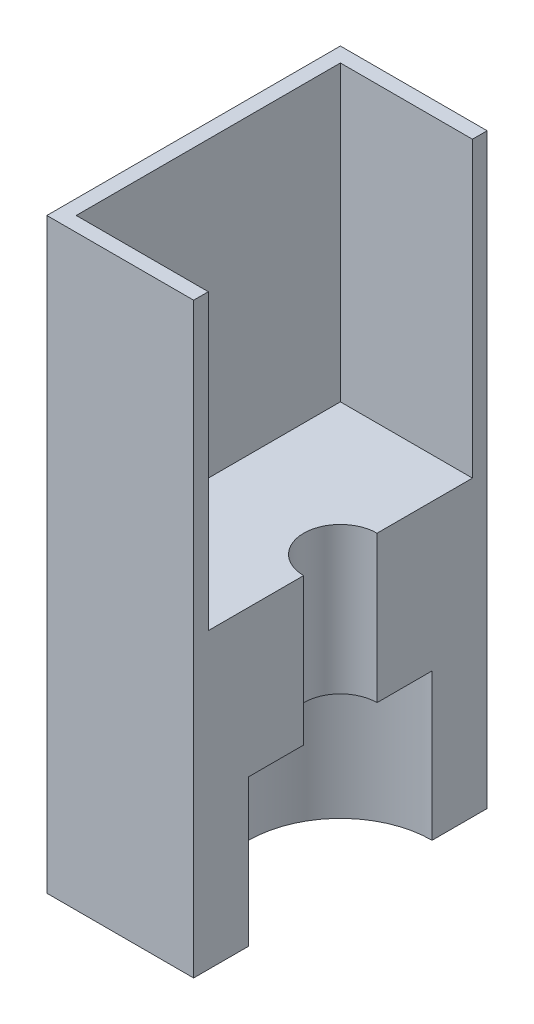
ISO-10303-21;
HEADER;
FILE_DESCRIPTION(('STEP AP214'),'2;1');
FILE_NAME('part.step','',(''),(''),'','','');
FILE_SCHEMA(('AUTOMOTIVE_DESIGN { 1 0 10303 214 1 1 1 1 }'));
ENDSEC;
DATA;
#1=APPLICATION_CONTEXT('core data for automotive mechanical design processes');
#2=APPLICATION_PROTOCOL_DEFINITION('international standard','automotive_design',2000,#1);
#3=PRODUCT_CONTEXT('',#1,'mechanical');
#4=PRODUCT('Part','Part','',(#3));
#5=PRODUCT_RELATED_PRODUCT_CATEGORY('part','',(#4));
#6=PRODUCT_DEFINITION_FORMATION('','',#4);
#7=PRODUCT_DEFINITION_CONTEXT('part definition',#1,'design');
#8=PRODUCT_DEFINITION('design','',#6,#7);
#9=PRODUCT_DEFINITION_SHAPE('','',#8);
#10=(LENGTH_UNIT() NAMED_UNIT(*) SI_UNIT(.MILLI.,.METRE.));
#11=(NAMED_UNIT(*) PLANE_ANGLE_UNIT() SI_UNIT($,.RADIAN.));
#12=(NAMED_UNIT(*) SI_UNIT($,.STERADIAN.) SOLID_ANGLE_UNIT());
#13=UNCERTAINTY_MEASURE_WITH_UNIT(LENGTH_MEASURE(1.E-05),#10,'distance_accuracy_value','');
#14=(GEOMETRIC_REPRESENTATION_CONTEXT(3) GLOBAL_UNCERTAINTY_ASSIGNED_CONTEXT((#13)) GLOBAL_UNIT_ASSIGNED_CONTEXT((#10,
#11,#12)) REPRESENTATION_CONTEXT('',''));
#15=CARTESIAN_POINT('',(0.,0.,0.));
#16=DIRECTION('',(0.,0.,1.));
#17=DIRECTION('',(1.,0.,0.));
#18=AXIS2_PLACEMENT_3D('',#15,#16,#17);
#19=CARTESIAN_POINT('',(0.,-0.00999999999999612,0.));
#20=DIRECTION('',(-1.,0.,0.));
#21=DIRECTION('',(0.,0.,1.));
#22=AXIS2_PLACEMENT_3D('',#19,#20,#21);
#23=PLANE('',#22);
#24=DIRECTION('',(0.,-1.,0.));
#25=VECTOR('',#24,1.);
#26=CARTESIAN_POINT('',(0.,80.,-20.));
#27=LINE('',#26,#25);
#28=CARTESIAN_POINT('',(0.,80.,-20.));
#29=VERTEX_POINT('',#28);
#30=CARTESIAN_POINT('',(0.,0.,-20.));
#31=VERTEX_POINT('',#30);
#32=EDGE_CURVE('E204',#29,#31,#27,.T.);
#33=ORIENTED_EDGE('',*,*,#32,.F.);
#34=DIRECTION('',(0.,0.,1.));
#35=VECTOR('',#34,1.);
#36=CARTESIAN_POINT('',(0.,80.,0.));
#37=LINE('',#36,#35);
#38=CARTESIAN_POINT('',(0.,80.,-18.));
#39=VERTEX_POINT('',#38);
#40=EDGE_CURVE('E201',#29,#39,#37,.T.);
#41=ORIENTED_EDGE('',*,*,#40,.T.);
#42=DIRECTION('',(0.,1.,0.));
#43=VECTOR('',#42,1.);
#44=CARTESIAN_POINT('',(0.,40.,-18.));
#45=LINE('',#44,#43);
#46=CARTESIAN_POINT('',(0.,40.,-18.));
#47=VERTEX_POINT('',#46);
#48=EDGE_CURVE('E196',#47,#39,#45,.T.);
#49=ORIENTED_EDGE('',*,*,#48,.F.);
#50=DIRECTION('',(0.,0.,1.));
#51=VECTOR('',#50,1.);
#52=CARTESIAN_POINT('',(0.,40.,0.));
#53=LINE('',#52,#51);
#54=CARTESIAN_POINT('',(0.,40.,-5.));
#55=VERTEX_POINT('',#54);
#56=EDGE_CURVE('E50',#47,#55,#53,.T.);
#57=ORIENTED_EDGE('',*,*,#56,.T.);
#58=DIRECTION('',(0.,-1.,0.));
#59=VECTOR('',#58,1.);
#60=CARTESIAN_POINT('',(0.,60.,-5.));
#61=LINE('',#60,#59);
#62=CARTESIAN_POINT('',(0.,20.,-5.));
#63=VERTEX_POINT('',#62);
#64=EDGE_CURVE('E194',#63,#55,#61,.F.);
#65=ORIENTED_EDGE('',*,*,#64,.F.);
#66=DIRECTION('',(0.,0.,-1.));
#67=VECTOR('',#66,1.);
#68=CARTESIAN_POINT('',(0.,20.,0.));
#69=LINE('',#68,#67);
#70=CARTESIAN_POINT('',(0.,20.,-12.5));
#71=VERTEX_POINT('',#70);
#72=EDGE_CURVE('E210',#63,#71,#69,.T.);
#73=ORIENTED_EDGE('',*,*,#72,.T.);
#74=DIRECTION('',(0.,-1.,0.));
#75=VECTOR('',#74,1.);
#76=CARTESIAN_POINT('',(0.,20.,-12.5));
#77=LINE('',#76,#75);
#78=CARTESIAN_POINT('',(0.,0.,-12.5));
#79=VERTEX_POINT('',#78);
#80=EDGE_CURVE('E45',#79,#71,#77,.F.);
#81=ORIENTED_EDGE('',*,*,#80,.F.);
#82=DIRECTION('',(0.,0.,1.));
#83=VECTOR('',#82,1.);
#84=CARTESIAN_POINT('',(0.,0.,0.));
#85=LINE('',#84,#83);
#86=EDGE_CURVE('E205',#31,#79,#85,.T.);
#87=ORIENTED_EDGE('',*,*,#86,.F.);
#88=EDGE_LOOP('',(#33,#41,#49,#57,#65,#73,#81,#87));
#89=FACE_BOUND('',#88,.T.);
#90=ADVANCED_FACE('F42',(#89),#23,.F.);
#91=DIRECTION('',(0.,-1.,0.));
#92=VECTOR('',#91,1.);
#93=CARTESIAN_POINT('',(0.,20.,12.5));
#94=LINE('',#93,#92);
#95=CARTESIAN_POINT('',(0.,20.,12.5));
#96=VERTEX_POINT('',#95);
#97=CARTESIAN_POINT('',(0.,0.,12.5));
#98=VERTEX_POINT('',#97);
#99=EDGE_CURVE('E209',#96,#98,#94,.T.);
#100=ORIENTED_EDGE('',*,*,#99,.F.);
#101=CARTESIAN_POINT('',(0.,20.,5.));
#102=VERTEX_POINT('',#101);
#103=EDGE_CURVE('E200',#96,#102,#69,.T.);
#104=ORIENTED_EDGE('',*,*,#103,.T.);
#105=DIRECTION('',(0.,-1.,0.));
#106=VECTOR('',#105,1.);
#107=CARTESIAN_POINT('',(0.,60.,5.));
#108=LINE('',#107,#106);
#109=CARTESIAN_POINT('',(0.,40.,5.));
#110=VERTEX_POINT('',#109);
#111=EDGE_CURVE('E189',#110,#102,#108,.T.);
#112=ORIENTED_EDGE('',*,*,#111,.F.);
#113=CARTESIAN_POINT('',(0.,40.,18.));
#114=VERTEX_POINT('',#113);
#115=EDGE_CURVE('E11',#110,#114,#53,.T.);
#116=ORIENTED_EDGE('',*,*,#115,.T.);
#117=DIRECTION('',(0.,-1.,0.));
#118=VECTOR('',#117,1.);
#119=CARTESIAN_POINT('',(0.,40.,18.));
#120=LINE('',#119,#118);
#121=CARTESIAN_POINT('',(0.,80.,18.));
#122=VERTEX_POINT('',#121);
#123=EDGE_CURVE('E65',#122,#114,#120,.T.);
#124=ORIENTED_EDGE('',*,*,#123,.F.);
#125=CARTESIAN_POINT('',(0.,80.,20.));
#126=VERTEX_POINT('',#125);
#127=EDGE_CURVE('E197',#122,#126,#37,.T.);
#128=ORIENTED_EDGE('',*,*,#127,.T.);
#129=DIRECTION('',(0.,1.,0.));
#130=VECTOR('',#129,1.);
#131=CARTESIAN_POINT('',(0.,80.,20.));
#132=LINE('',#131,#130);
#133=CARTESIAN_POINT('',(0.,0.,20.));
#134=VERTEX_POINT('',#133);
#135=EDGE_CURVE('E202',#134,#126,#132,.T.);
#136=ORIENTED_EDGE('',*,*,#135,.F.);
#137=EDGE_CURVE('E215',#98,#134,#85,.T.);
#138=ORIENTED_EDGE('',*,*,#137,.F.);
#139=EDGE_LOOP('',(#100,#104,#112,#116,#124,#128,#136,#138));
#140=FACE_BOUND('',#139,.T.);
#141=ADVANCED_FACE('F228',(#140),#23,.F.);
#142=CARTESIAN_POINT('',(-20.,80.,-20.));
#143=DIRECTION('',(1.,0.,0.));
#144=DIRECTION('',(0.,0.,-1.));
#145=AXIS2_PLACEMENT_3D('',#142,#143,#144);
#146=PLANE('',#145);
#147=DIRECTION('',(0.,0.,1.));
#148=VECTOR('',#147,1.);
#149=CARTESIAN_POINT('',(-20.,0.,-20.));
#150=LINE('',#149,#148);
#151=CARTESIAN_POINT('',(-20.,0.,-20.));
#152=VERTEX_POINT('',#151);
#153=CARTESIAN_POINT('',(-20.,0.,20.));
#154=VERTEX_POINT('',#153);
#155=EDGE_CURVE('E180',#152,#154,#150,.T.);
#156=ORIENTED_EDGE('',*,*,#155,.T.);
#157=DIRECTION('',(0.,-1.,0.));
#158=VECTOR('',#157,1.);
#159=CARTESIAN_POINT('',(-20.,80.,20.));
#160=LINE('',#159,#158);
#161=CARTESIAN_POINT('',(-20.,80.,20.));
#162=VERTEX_POINT('',#161);
#163=EDGE_CURVE('E178',#162,#154,#160,.T.);
#164=ORIENTED_EDGE('',*,*,#163,.F.);
#165=DIRECTION('',(0.,0.,1.));
#166=VECTOR('',#165,1.);
#167=CARTESIAN_POINT('',(-20.,80.,-20.));
#168=LINE('',#167,#166);
#169=CARTESIAN_POINT('',(-20.,80.,-20.));
#170=VERTEX_POINT('',#169);
#171=EDGE_CURVE('E172',#170,#162,#168,.T.);
#172=ORIENTED_EDGE('',*,*,#171,.F.);
#173=DIRECTION('',(0.,-1.,0.));
#174=VECTOR('',#173,1.);
#175=CARTESIAN_POINT('',(-20.,80.,-20.));
#176=LINE('',#175,#174);
#177=EDGE_CURVE('E186',#170,#152,#176,.T.);
#178=ORIENTED_EDGE('',*,*,#177,.T.);
#179=EDGE_LOOP('',(#156,#164,#172,#178));
#180=FACE_BOUND('',#179,.T.);
#181=ADVANCED_FACE('F253',(#180),#146,.F.);
#182=CARTESIAN_POINT('',(-20.,80.,20.));
#183=DIRECTION('',(0.,0.,-1.));
#184=DIRECTION('',(-1.,0.,0.));
#185=AXIS2_PLACEMENT_3D('',#182,#183,#184);
#186=PLANE('',#185);
#187=DIRECTION('',(1.,0.,0.));
#188=VECTOR('',#187,1.);
#189=CARTESIAN_POINT('',(-20.,0.,20.));
#190=LINE('',#189,#188);
#191=EDGE_CURVE('E173',#154,#134,#190,.T.);
#192=ORIENTED_EDGE('',*,*,#191,.T.);
#193=ORIENTED_EDGE('',*,*,#135,.T.);
#194=DIRECTION('',(1.,0.,0.));
#195=VECTOR('',#194,1.);
#196=CARTESIAN_POINT('',(-20.,80.,20.));
#197=LINE('',#196,#195);
#198=EDGE_CURVE('E175',#162,#126,#197,.T.);
#199=ORIENTED_EDGE('',*,*,#198,.F.);
#200=ORIENTED_EDGE('',*,*,#163,.T.);
#201=EDGE_LOOP('',(#192,#193,#199,#200));
#202=FACE_BOUND('',#201,.T.);
#203=ADVANCED_FACE('F249',(#202),#186,.F.);
#204=CARTESIAN_POINT('',(-20.,80.,-20.));
#205=DIRECTION('',(0.,0.,1.));
#206=DIRECTION('',(1.,0.,0.));
#207=AXIS2_PLACEMENT_3D('',#204,#205,#206);
#208=PLANE('',#207);
#209=DIRECTION('',(-1.,0.,0.));
#210=VECTOR('',#209,1.);
#211=CARTESIAN_POINT('',(-20.,80.,-20.));
#212=LINE('',#211,#210);
#213=EDGE_CURVE('E170',#29,#170,#212,.T.);
#214=ORIENTED_EDGE('',*,*,#213,.F.);
#215=ORIENTED_EDGE('',*,*,#32,.T.);
#216=DIRECTION('',(-1.,0.,0.));
#217=VECTOR('',#216,1.);
#218=CARTESIAN_POINT('',(-20.,0.,-20.));
#219=LINE('',#218,#217);
#220=EDGE_CURVE('E167',#31,#152,#219,.T.);
#221=ORIENTED_EDGE('',*,*,#220,.T.);
#222=ORIENTED_EDGE('',*,*,#177,.F.);
#223=EDGE_LOOP('',(#214,#215,#221,#222));
#224=FACE_BOUND('',#223,.T.);
#225=ADVANCED_FACE('F256',(#224),#208,.F.);
#226=CARTESIAN_POINT('',(0.,0.,0.));
#227=DIRECTION('',(0.,1.,0.));
#228=DIRECTION('',(0.,0.,1.));
#229=AXIS2_PLACEMENT_3D('',#226,#227,#228);
#230=PLANE('',#229);
#231=ORIENTED_EDGE('',*,*,#220,.F.);
#232=ORIENTED_EDGE('',*,*,#86,.T.);
#233=CARTESIAN_POINT('',(0.,0.,0.));
#234=DIRECTION('',(0.,-1.,0.));
#235=DIRECTION('',(0.,0.,-1.));
#236=AXIS2_PLACEMENT_3D('',#233,#234,#235);
#237=CIRCLE('',#236,12.5);
#238=EDGE_CURVE('E162',#98,#79,#237,.T.);
#239=ORIENTED_EDGE('',*,*,#238,.F.);
#240=ORIENTED_EDGE('',*,*,#137,.T.);
#241=ORIENTED_EDGE('',*,*,#191,.F.);
#242=ORIENTED_EDGE('',*,*,#155,.F.);
#243=EDGE_LOOP('',(#231,#232,#239,#240,#241,#242));
#244=FACE_BOUND('',#243,.T.);
#245=ADVANCED_FACE('F245',(#244),#230,.F.);
#246=CARTESIAN_POINT('',(0.,20.,0.));
#247=DIRECTION('',(0.,-1.,0.));
#248=DIRECTION('',(0.,0.,-1.));
#249=AXIS2_PLACEMENT_3D('',#246,#247,#248);
#250=CYLINDRICAL_SURFACE('',#249,12.5);
#251=ORIENTED_EDGE('',*,*,#238,.T.);
#252=ORIENTED_EDGE('',*,*,#80,.T.);
#253=CARTESIAN_POINT('',(0.,20.,0.));
#254=DIRECTION('',(0.,-1.,0.));
#255=DIRECTION('',(0.,0.,-1.));
#256=AXIS2_PLACEMENT_3D('',#253,#254,#255);
#257=CIRCLE('',#256,12.5);
#258=EDGE_CURVE('E164',#96,#71,#257,.T.);
#259=ORIENTED_EDGE('',*,*,#258,.F.);
#260=ORIENTED_EDGE('',*,*,#99,.T.);
#261=EDGE_LOOP('',(#251,#252,#259,#260));
#262=FACE_BOUND('',#261,.T.);
#263=ADVANCED_FACE('F239',(#262),#250,.F.);
#264=CARTESIAN_POINT('',(0.,80.,0.));
#265=DIRECTION('',(0.,1.,0.));
#266=DIRECTION('',(0.,0.,1.));
#267=AXIS2_PLACEMENT_3D('',#264,#265,#266);
#268=PLANE('',#267);
#269=ORIENTED_EDGE('',*,*,#40,.F.);
#270=ORIENTED_EDGE('',*,*,#213,.T.);
#271=ORIENTED_EDGE('',*,*,#171,.T.);
#272=ORIENTED_EDGE('',*,*,#198,.T.);
#273=ORIENTED_EDGE('',*,*,#127,.F.);
#274=DIRECTION('',(1.,0.,0.));
#275=VECTOR('',#274,1.);
#276=CARTESIAN_POINT('',(-18.,80.,18.));
#277=LINE('',#276,#275);
#278=CARTESIAN_POINT('',(-18.,80.,18.));
#279=VERTEX_POINT('',#278);
#280=EDGE_CURVE('E139',#279,#122,#277,.T.);
#281=ORIENTED_EDGE('',*,*,#280,.F.);
#282=DIRECTION('',(0.,0.,1.));
#283=VECTOR('',#282,1.);
#284=CARTESIAN_POINT('',(-18.,80.,-18.));
#285=LINE('',#284,#283);
#286=CARTESIAN_POINT('',(-18.,80.,-18.));
#287=VERTEX_POINT('',#286);
#288=EDGE_CURVE('E158',#287,#279,#285,.T.);
#289=ORIENTED_EDGE('',*,*,#288,.F.);
#290=DIRECTION('',(-1.,0.,0.));
#291=VECTOR('',#290,1.);
#292=CARTESIAN_POINT('',(-18.,80.,-18.));
#293=LINE('',#292,#291);
#294=EDGE_CURVE('E145',#39,#287,#293,.T.);
#295=ORIENTED_EDGE('',*,*,#294,.F.);
#296=EDGE_LOOP('',(#269,#270,#271,#272,#273,#281,#289,#295));
#297=FACE_BOUND('',#296,.T.);
#298=ADVANCED_FACE('F221',(#297),#268,.T.);
#299=CARTESIAN_POINT('',(-18.,40.,18.));
#300=DIRECTION('',(0.,0.,1.));
#301=DIRECTION('',(1.,0.,0.));
#302=AXIS2_PLACEMENT_3D('',#299,#300,#301);
#303=PLANE('',#302);
#304=ORIENTED_EDGE('',*,*,#280,.T.);
#305=ORIENTED_EDGE('',*,*,#123,.T.);
#306=DIRECTION('',(1.,0.,0.));
#307=VECTOR('',#306,1.);
#308=CARTESIAN_POINT('',(-18.,40.,18.));
#309=LINE('',#308,#307);
#310=CARTESIAN_POINT('',(-18.,40.,18.));
#311=VERTEX_POINT('',#310);
#312=EDGE_CURVE('E150',#311,#114,#309,.T.);
#313=ORIENTED_EDGE('',*,*,#312,.F.);
#314=DIRECTION('',(0.,1.,0.));
#315=VECTOR('',#314,1.);
#316=CARTESIAN_POINT('',(-18.,40.,18.));
#317=LINE('',#316,#315);
#318=EDGE_CURVE('E149',#311,#279,#317,.T.);
#319=ORIENTED_EDGE('',*,*,#318,.T.);
#320=EDGE_LOOP('',(#304,#305,#313,#319));
#321=FACE_BOUND('',#320,.T.);
#322=ADVANCED_FACE('F223',(#321),#303,.F.);
#323=CARTESIAN_POINT('',(-18.,40.,-18.));
#324=DIRECTION('',(-1.,0.,0.));
#325=DIRECTION('',(0.,0.,1.));
#326=AXIS2_PLACEMENT_3D('',#323,#324,#325);
#327=PLANE('',#326);
#328=ORIENTED_EDGE('',*,*,#288,.T.);
#329=ORIENTED_EDGE('',*,*,#318,.F.);
#330=DIRECTION('',(0.,0.,1.));
#331=VECTOR('',#330,1.);
#332=CARTESIAN_POINT('',(-18.,40.,-18.));
#333=LINE('',#332,#331);
#334=CARTESIAN_POINT('',(-18.,40.,-18.));
#335=VERTEX_POINT('',#334);
#336=EDGE_CURVE('E137',#335,#311,#333,.T.);
#337=ORIENTED_EDGE('',*,*,#336,.F.);
#338=DIRECTION('',(0.,1.,0.));
#339=VECTOR('',#338,1.);
#340=CARTESIAN_POINT('',(-18.,40.,-18.));
#341=LINE('',#340,#339);
#342=EDGE_CURVE('E142',#335,#287,#341,.T.);
#343=ORIENTED_EDGE('',*,*,#342,.T.);
#344=EDGE_LOOP('',(#328,#329,#337,#343));
#345=FACE_BOUND('',#344,.T.);
#346=ADVANCED_FACE('F152',(#345),#327,.F.);
#347=CARTESIAN_POINT('',(-18.,40.,-18.));
#348=DIRECTION('',(0.,0.,-1.));
#349=DIRECTION('',(-1.,0.,0.));
#350=AXIS2_PLACEMENT_3D('',#347,#348,#349);
#351=PLANE('',#350);
#352=DIRECTION('',(-1.,0.,0.));
#353=VECTOR('',#352,1.);
#354=CARTESIAN_POINT('',(-18.,40.,-18.));
#355=LINE('',#354,#353);
#356=EDGE_CURVE('E132',#47,#335,#355,.T.);
#357=ORIENTED_EDGE('',*,*,#356,.F.);
#358=ORIENTED_EDGE('',*,*,#48,.T.);
#359=ORIENTED_EDGE('',*,*,#294,.T.);
#360=ORIENTED_EDGE('',*,*,#342,.F.);
#361=EDGE_LOOP('',(#357,#358,#359,#360));
#362=FACE_BOUND('',#361,.T.);
#363=ADVANCED_FACE('F143',(#362),#351,.F.);
#364=CARTESIAN_POINT('',(0.,40.,0.));
#365=DIRECTION('',(0.,1.,0.));
#366=DIRECTION('',(0.,0.,1.));
#367=AXIS2_PLACEMENT_3D('',#364,#365,#366);
#368=PLANE('',#367);
#369=ORIENTED_EDGE('',*,*,#56,.F.);
#370=ORIENTED_EDGE('',*,*,#356,.T.);
#371=ORIENTED_EDGE('',*,*,#336,.T.);
#372=ORIENTED_EDGE('',*,*,#312,.T.);
#373=ORIENTED_EDGE('',*,*,#115,.F.);
#374=CARTESIAN_POINT('',(0.,40.,0.));
#375=DIRECTION('',(0.,1.,0.));
#376=DIRECTION('',(0.,0.,1.));
#377=AXIS2_PLACEMENT_3D('',#374,#375,#376);
#378=CIRCLE('',#377,5.);
#379=EDGE_CURVE('E159',#55,#110,#378,.T.);
#380=ORIENTED_EDGE('',*,*,#379,.F.);
#381=EDGE_LOOP('',(#369,#370,#371,#372,#373,#380));
#382=FACE_BOUND('',#381,.T.);
#383=ADVANCED_FACE('F134',(#382),#368,.T.);
#384=CARTESIAN_POINT('',(0.,20.,0.));
#385=DIRECTION('',(0.,-1.,0.));
#386=DIRECTION('',(0.,0.,-1.));
#387=AXIS2_PLACEMENT_3D('',#384,#385,#386);
#388=PLANE('',#387);
#389=ORIENTED_EDGE('',*,*,#103,.F.);
#390=ORIENTED_EDGE('',*,*,#258,.T.);
#391=ORIENTED_EDGE('',*,*,#72,.F.);
#392=CARTESIAN_POINT('',(0.,20.,0.));
#393=DIRECTION('',(0.,-1.,0.));
#394=DIRECTION('',(0.,0.,-1.));
#395=AXIS2_PLACEMENT_3D('',#392,#393,#394);
#396=CIRCLE('',#395,5.);
#397=EDGE_CURVE('E192',#102,#63,#396,.T.);
#398=ORIENTED_EDGE('',*,*,#397,.F.);
#399=EDGE_LOOP('',(#389,#390,#391,#398));
#400=FACE_BOUND('',#399,.T.);
#401=ADVANCED_FACE('F237',(#400),#388,.T.);
#402=CARTESIAN_POINT('',(0.,60.,0.));
#403=DIRECTION('',(0.,-1.,0.));
#404=DIRECTION('',(0.,0.,-1.));
#405=AXIS2_PLACEMENT_3D('',#402,#403,#404);
#406=CYLINDRICAL_SURFACE('',#405,5.);
#407=ORIENTED_EDGE('',*,*,#397,.T.);
#408=ORIENTED_EDGE('',*,*,#64,.T.);
#409=ORIENTED_EDGE('',*,*,#379,.T.);
#410=ORIENTED_EDGE('',*,*,#111,.T.);
#411=EDGE_LOOP('',(#407,#408,#409,#410));
#412=FACE_BOUND('',#411,.T.);
#413=ADVANCED_FACE('F232',(#412),#406,.F.);
#414=CLOSED_SHELL('',(#90,#141,#181,#203,#225,#245,#263,#298,#322,#346,#363,#383,#401,#413));
#415=MANIFOLD_SOLID_BREP('B2',#414);
#416=ADVANCED_BREP_SHAPE_REPRESENTATION('',(#18,#415),#14);
#417=SHAPE_DEFINITION_REPRESENTATION(#9,#416);
ENDSEC;
END-ISO-10303-21;
